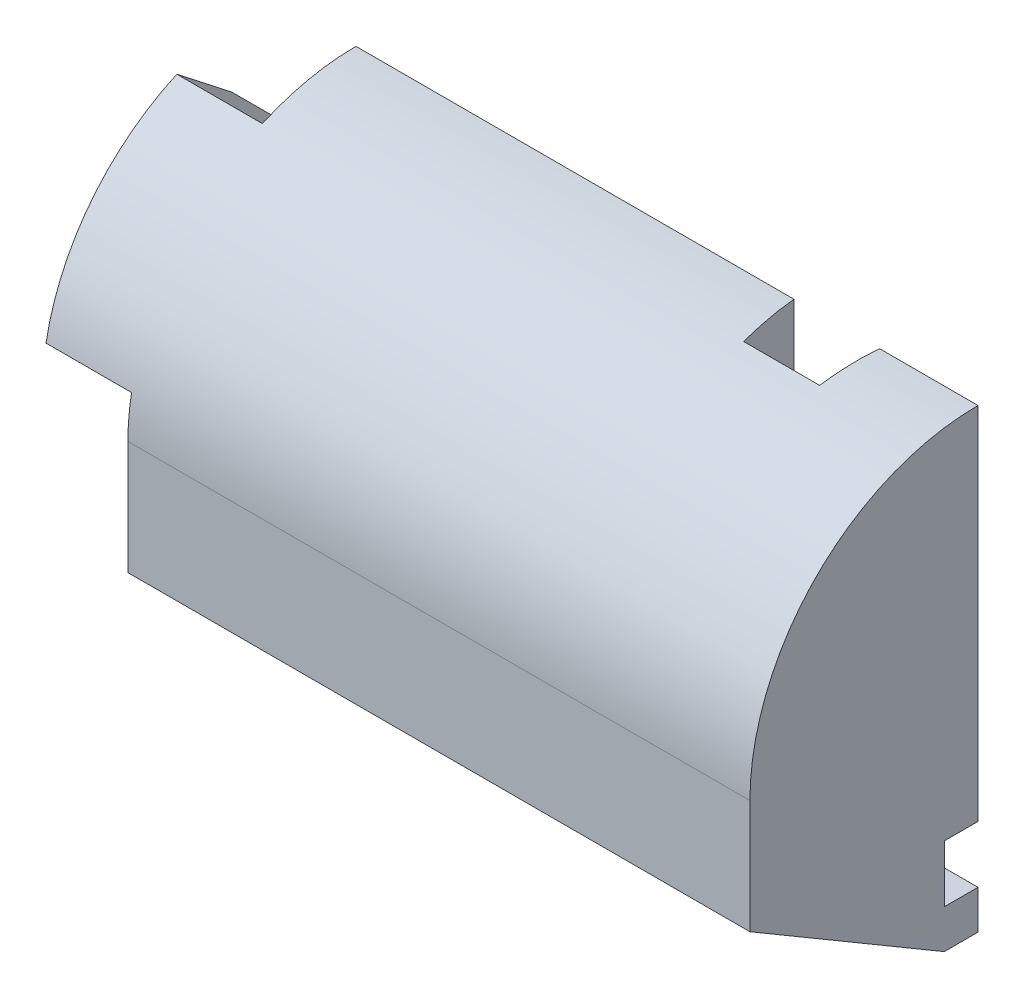
ISO-10303-21;
HEADER;
FILE_DESCRIPTION(('STEP AP214'),'2;1');
FILE_NAME('part.step','',(''),(''),'','','');
FILE_SCHEMA(('AUTOMOTIVE_DESIGN { 1 0 10303 214 1 1 1 1 }'));
ENDSEC;
DATA;
#1=APPLICATION_CONTEXT('core data for automotive mechanical design processes');
#2=APPLICATION_PROTOCOL_DEFINITION('international standard','automotive_design',2000,#1);
#3=PRODUCT_CONTEXT('',#1,'mechanical');
#4=PRODUCT('Part','Part','',(#3));
#5=PRODUCT_RELATED_PRODUCT_CATEGORY('part','',(#4));
#6=PRODUCT_DEFINITION_FORMATION('','',#4);
#7=PRODUCT_DEFINITION_CONTEXT('part definition',#1,'design');
#8=PRODUCT_DEFINITION('design','',#6,#7);
#9=PRODUCT_DEFINITION_SHAPE('','',#8);
#10=(LENGTH_UNIT() NAMED_UNIT(*) SI_UNIT(.MILLI.,.METRE.));
#11=(NAMED_UNIT(*) PLANE_ANGLE_UNIT() SI_UNIT($,.RADIAN.));
#12=(NAMED_UNIT(*) SI_UNIT($,.STERADIAN.) SOLID_ANGLE_UNIT());
#13=UNCERTAINTY_MEASURE_WITH_UNIT(LENGTH_MEASURE(1.E-05),#10,'distance_accuracy_value','');
#14=(GEOMETRIC_REPRESENTATION_CONTEXT(3) GLOBAL_UNCERTAINTY_ASSIGNED_CONTEXT((#13)) GLOBAL_UNIT_ASSIGNED_CONTEXT((#10,
#11,#12)) REPRESENTATION_CONTEXT('',''));
#15=CARTESIAN_POINT('',(0.,0.,0.));
#16=DIRECTION('',(0.,0.,1.));
#17=DIRECTION('',(1.,0.,0.));
#18=AXIS2_PLACEMENT_3D('',#15,#16,#17);
#19=CARTESIAN_POINT('',(240.,-88.,0.));
#20=DIRECTION('',(0.,0.,1.));
#21=DIRECTION('',(1.,0.,0.));
#22=AXIS2_PLACEMENT_3D('',#19,#20,#21);
#23=PLANE('',#22);
#24=DIRECTION('',(0.,-1.,0.));
#25=VECTOR('',#24,1.);
#26=CARTESIAN_POINT('',(169.,100.,0.));
#27=LINE('',#26,#25);
#28=CARTESIAN_POINT('',(169.,88.,0.));
#29=VERTEX_POINT('',#28);
#30=CARTESIAN_POINT('',(169.,28.575,0.));
#31=VERTEX_POINT('',#30);
#32=EDGE_CURVE('E191',#29,#31,#27,.T.);
#33=ORIENTED_EDGE('',*,*,#32,.T.);
#34=DIRECTION('',(-1.,0.,0.));
#35=VECTOR('',#34,1.);
#36=CARTESIAN_POINT('',(235.,28.575,0.));
#37=LINE('',#36,#35);
#38=CARTESIAN_POINT('',(78.0000000000001,28.575,0.));
#39=VERTEX_POINT('',#38);
#40=EDGE_CURVE('E242',#39,#31,#37,.F.);
#41=ORIENTED_EDGE('',*,*,#40,.F.);
#42=DIRECTION('',(0.,1.,0.));
#43=VECTOR('',#42,1.);
#44=CARTESIAN_POINT('',(78.,-88.,0.));
#45=LINE('',#44,#43);
#46=CARTESIAN_POINT('',(78.,44.45,0.));
#47=VERTEX_POINT('',#46);
#48=EDGE_CURVE('E348',#39,#47,#45,.T.);
#49=ORIENTED_EDGE('',*,*,#48,.T.);
#50=DIRECTION('',(-1.,0.,0.));
#51=VECTOR('',#50,1.);
#52=CARTESIAN_POINT('',(78.,44.45,0.));
#53=LINE('',#52,#51);
#54=CARTESIAN_POINT('',(0.,44.45,0.));
#55=VERTEX_POINT('',#54);
#56=EDGE_CURVE('E354',#55,#47,#53,.F.);
#57=ORIENTED_EDGE('',*,*,#56,.F.);
#58=DIRECTION('',(0.,1.,0.));
#59=VECTOR('',#58,1.);
#60=CARTESIAN_POINT('',(0.,-88.,0.));
#61=LINE('',#60,#59);
#62=CARTESIAN_POINT('',(0.,88.,0.));
#63=VERTEX_POINT('',#62);
#64=EDGE_CURVE('E275',#55,#63,#61,.T.);
#65=ORIENTED_EDGE('',*,*,#64,.T.);
#66=DIRECTION('',(-1.,0.,0.));
#67=VECTOR('',#66,1.);
#68=CARTESIAN_POINT('',(240.,88.,0.));
#69=LINE('',#68,#67);
#70=EDGE_CURVE('E208',#29,#63,#69,.T.);
#71=ORIENTED_EDGE('',*,*,#70,.F.);
#72=EDGE_LOOP('',(#33,#41,#49,#57,#65,#71));
#73=FACE_BOUND('',#72,.T.);
#74=ADVANCED_FACE('F39',(#73),#23,.F.);
#75=CARTESIAN_POINT('',(240.,0.,0.));
#76=DIRECTION('',(-1.,0.,0.));
#77=DIRECTION('',(0.,0.,1.));
#78=AXIS2_PLACEMENT_3D('',#75,#76,#77);
#79=CYLINDRICAL_SURFACE('',#78,88.);
#80=CARTESIAN_POINT('',(169.,0.,0.));
#81=DIRECTION('',(0.996194698091746,0.,-0.0871557427476516));
#82=DIRECTION('',(-0.0871557427476516,0.,-0.996194698091746));
#83=AXIS2_PLACEMENT_3D('',#80,#81,#82);
#84=ELLIPSE('',#83,88.3361457038145,88.);
#85=CARTESIAN_POINT('',(170.85743895347,85.400588921409,21.2306243873445));
#86=VERTEX_POINT('',#85);
#87=EDGE_CURVE('E236',#29,#86,#84,.T.);
#88=ORIENTED_EDGE('',*,*,#87,.F.);
#89=ORIENTED_EDGE('',*,*,#70,.T.);
#90=CARTESIAN_POINT('',(0.,0.,0.));
#91=DIRECTION('',(1.,0.,0.));
#92=DIRECTION('',(0.,0.,-1.));
#93=AXIS2_PLACEMENT_3D('',#90,#91,#92);
#94=CIRCLE('',#93,88.);
#95=CARTESIAN_POINT('',(0.,80.2470868267044,36.1165482269191));
#96=VERTEX_POINT('',#95);
#97=EDGE_CURVE('E272',#63,#96,#94,.T.);
#98=ORIENTED_EDGE('',*,*,#97,.T.);
#99=DIRECTION('',(1.,0.,0.));
#100=VECTOR('',#99,1.);
#101=CARTESIAN_POINT('',(-33.,80.2470868267044,36.1165482269191));
#102=LINE('',#101,#100);
#103=CARTESIAN_POINT('',(-33.,80.2470868267044,36.1165482269191));
#104=VERTEX_POINT('',#103);
#105=EDGE_CURVE('E62',#104,#96,#102,.T.);
#106=ORIENTED_EDGE('',*,*,#105,.F.);
#107=CARTESIAN_POINT('',(-33.,0.,0.));
#108=DIRECTION('',(1.,0.,0.));
#109=DIRECTION('',(0.,0.,-1.));
#110=AXIS2_PLACEMENT_3D('',#107,#108,#109);
#111=CIRCLE('',#110,88.);
#112=CARTESIAN_POINT('',(-33.,15.6302050309532,86.6007892036231));
#113=VERTEX_POINT('',#112);
#114=EDGE_CURVE('E303',#113,#104,#111,.F.);
#115=ORIENTED_EDGE('',*,*,#114,.F.);
#116=DIRECTION('',(1.,0.,0.));
#117=VECTOR('',#116,1.);
#118=CARTESIAN_POINT('',(-33.,15.6302050309532,86.6007892036231));
#119=LINE('',#118,#117);
#120=CARTESIAN_POINT('',(0.,15.6302050309532,86.6007892036231));
#121=VERTEX_POINT('',#120);
#122=EDGE_CURVE('E302',#113,#121,#119,.T.);
#123=ORIENTED_EDGE('',*,*,#122,.T.);
#124=CARTESIAN_POINT('',(0.,0.,88.));
#125=VERTEX_POINT('',#124);
#126=EDGE_CURVE('E271',#121,#125,#94,.T.);
#127=ORIENTED_EDGE('',*,*,#126,.T.);
#128=DIRECTION('',(-1.,0.,0.));
#129=VECTOR('',#128,1.);
#130=CARTESIAN_POINT('',(240.,0.,88.));
#131=LINE('',#130,#129);
#132=CARTESIAN_POINT('',(240.,0.,88.));
#133=VERTEX_POINT('',#132);
#134=EDGE_CURVE('E213',#133,#125,#131,.T.);
#135=ORIENTED_EDGE('',*,*,#134,.F.);
#136=CARTESIAN_POINT('',(240.,0.,0.));
#137=DIRECTION('',(1.,0.,0.));
#138=DIRECTION('',(0.,0.,-1.));
#139=AXIS2_PLACEMENT_3D('',#136,#137,#138);
#140=CIRCLE('',#139,88.);
#141=CARTESIAN_POINT('',(240.,88.,0.));
#142=VERTEX_POINT('',#141);
#143=EDGE_CURVE('E206',#142,#133,#140,.T.);
#144=ORIENTED_EDGE('',*,*,#143,.F.);
#145=CARTESIAN_POINT('',(202.,88.,0.));
#146=VERTEX_POINT('',#145);
#147=EDGE_CURVE('E198',#142,#146,#69,.T.);
#148=ORIENTED_EDGE('',*,*,#147,.T.);
#149=CARTESIAN_POINT('',(202.,0.,0.));
#150=DIRECTION('',(0.996194698091746,0.,0.0871557427476593));
#151=DIRECTION('',(-0.0871557427476593,0.,0.996194698091746));
#152=AXIS2_PLACEMENT_3D('',#149,#150,#151);
#153=ELLIPSE('',#152,88.3361457038146,88.);
#154=CARTESIAN_POINT('',(200.14256104653,85.4005889214091,21.2306243873445));
#155=VERTEX_POINT('',#154);
#156=EDGE_CURVE('E183',#146,#155,#153,.T.);
#157=ORIENTED_EDGE('',*,*,#156,.T.);
#158=DIRECTION('',(-1.,0.,0.));
#159=VECTOR('',#158,1.);
#160=CARTESIAN_POINT('',(240.,85.400588921409,21.2306243873445));
#161=LINE('',#160,#159);
#162=EDGE_CURVE('E190',#155,#86,#161,.T.);
#163=ORIENTED_EDGE('',*,*,#162,.T.);
#164=EDGE_LOOP('',(#88,#89,#98,#106,#115,#123,#127,#135,#144,#148,#157,#163));
#165=FACE_BOUND('',#164,.T.);
#166=ADVANCED_FACE('F204',(#165),#79,.T.);
#167=CARTESIAN_POINT('',(235.,0.,0.));
#168=DIRECTION('',(-1.,0.,0.));
#169=DIRECTION('',(0.,0.,1.));
#170=AXIS2_PLACEMENT_3D('',#167,#168,#169);
#171=CYLINDRICAL_SURFACE('',#170,28.575);
#172=ORIENTED_EDGE('',*,*,#40,.T.);
#173=CARTESIAN_POINT('',(169.,0.,0.));
#174=DIRECTION('',(0.996194698091746,0.,-0.0871557427476516));
#175=DIRECTION('',(-0.0871557427476516,0.,-0.996194698091746));
#176=AXIS2_PLACEMENT_3D('',#173,#174,#175);
#177=ELLIPSE('',#176,28.6841518578011,28.575);
#178=CARTESIAN_POINT('',(170.85743895347,19.1256689588494,21.2306243873445));
#179=VERTEX_POINT('',#178);
#180=EDGE_CURVE('E11',#31,#179,#177,.T.);
#181=ORIENTED_EDGE('',*,*,#180,.T.);
#182=DIRECTION('',(-1.,0.,0.));
#183=VECTOR('',#182,1.);
#184=CARTESIAN_POINT('',(235.,19.1256689588494,21.2306243873445));
#185=LINE('',#184,#183);
#186=CARTESIAN_POINT('',(200.14256104653,19.1256689588494,21.2306243873445));
#187=VERTEX_POINT('',#186);
#188=EDGE_CURVE('E47',#187,#179,#185,.T.);
#189=ORIENTED_EDGE('',*,*,#188,.F.);
#190=CARTESIAN_POINT('',(202.,0.,0.));
#191=DIRECTION('',(0.996194698091746,0.,0.0871557427476593));
#192=DIRECTION('',(-0.0871557427476593,0.,0.996194698091746));
#193=AXIS2_PLACEMENT_3D('',#190,#191,#192);
#194=ELLIPSE('',#193,28.6841518578012,28.575);
#195=CARTESIAN_POINT('',(202.,28.575,0.));
#196=VERTEX_POINT('',#195);
#197=EDGE_CURVE('E225',#196,#187,#194,.T.);
#198=ORIENTED_EDGE('',*,*,#197,.F.);
#199=CARTESIAN_POINT('',(235.,28.575,0.));
#200=VERTEX_POINT('',#199);
#201=EDGE_CURVE('E201',#196,#200,#37,.F.);
#202=ORIENTED_EDGE('',*,*,#201,.T.);
#203=CARTESIAN_POINT('',(235.,0.,0.));
#204=DIRECTION('',(1.,0.,0.));
#205=DIRECTION('',(0.,0.,-1.));
#206=AXIS2_PLACEMENT_3D('',#203,#204,#205);
#207=CIRCLE('',#206,28.575);
#208=CARTESIAN_POINT('',(235.,-28.575,0.));
#209=VERTEX_POINT('',#208);
#210=EDGE_CURVE('E355',#200,#209,#207,.T.);
#211=ORIENTED_EDGE('',*,*,#210,.T.);
#212=DIRECTION('',(-1.,0.,0.));
#213=VECTOR('',#212,1.);
#214=CARTESIAN_POINT('',(235.,-28.575,0.));
#215=LINE('',#214,#213);
#216=CARTESIAN_POINT('',(78.,-28.575,0.));
#217=VERTEX_POINT('',#216);
#218=EDGE_CURVE('E251',#209,#217,#215,.T.);
#219=ORIENTED_EDGE('',*,*,#218,.T.);
#220=CARTESIAN_POINT('',(78.,0.,0.));
#221=DIRECTION('',(1.,0.,0.));
#222=DIRECTION('',(0.,0.,-1.));
#223=AXIS2_PLACEMENT_3D('',#220,#221,#222);
#224=CIRCLE('',#223,28.575);
#225=EDGE_CURVE('E223',#39,#217,#224,.T.);
#226=ORIENTED_EDGE('',*,*,#225,.F.);
#227=EDGE_LOOP('',(#172,#181,#189,#198,#202,#211,#219,#226));
#228=FACE_BOUND('',#227,.T.);
#229=ADVANCED_FACE('F239',(#228),#171,.F.);
#230=CARTESIAN_POINT('',(0.,0.,0.));
#231=DIRECTION('',(1.,0.,0.));
#232=DIRECTION('',(0.,0.,-1.));
#233=AXIS2_PLACEMENT_3D('',#230,#231,#232);
#234=PLANE('',#233);
#235=DIRECTION('',(0.,0.615661475325659,0.788010753606721));
#236=VECTOR('',#235,1.);
#237=CARTESIAN_POINT('',(0.,-32.3084408978756,25.242120488352));
#238=LINE('',#237,#236);
#239=CARTESIAN_POINT('',(0.,-0.90970565626694,65.4306689222948));
#240=VERTEX_POINT('',#239);
#241=EDGE_CURVE('E298',#240,#121,#238,.T.);
#242=ORIENTED_EDGE('',*,*,#241,.F.);
#243=DIRECTION('',(0.,-0.788010753606721,0.615661475325659));
#244=VECTOR('',#243,1.);
#245=CARTESIAN_POINT('',(0.,31.3987352416086,40.1885484339428));
#246=LINE('',#245,#244);
#247=CARTESIAN_POINT('',(0.,63.7071761394842,14.9464279455908));
#248=VERTEX_POINT('',#247);
#249=EDGE_CURVE('E382',#248,#240,#246,.T.);
#250=ORIENTED_EDGE('',*,*,#249,.F.);
#251=DIRECTION('',(0.,0.615661475325659,0.788010753606722));
#252=VECTOR('',#251,1.);
#253=CARTESIAN_POINT('',(0.,32.3084408978756,-25.242120488352));
#254=LINE('',#253,#252);
#255=EDGE_CURVE('E371',#248,#96,#254,.T.);
#256=ORIENTED_EDGE('',*,*,#255,.T.);
#257=ORIENTED_EDGE('',*,*,#97,.F.);
#258=ORIENTED_EDGE('',*,*,#64,.F.);
#259=CARTESIAN_POINT('',(0.,0.,0.));
#260=DIRECTION('',(1.,0.,0.));
#261=DIRECTION('',(0.,0.,-1.));
#262=AXIS2_PLACEMENT_3D('',#259,#260,#261);
#263=CIRCLE('',#262,44.45);
#264=CARTESIAN_POINT('',(0.,-44.45,0.));
#265=VERTEX_POINT('',#264);
#266=EDGE_CURVE('E344',#55,#265,#263,.T.);
#267=ORIENTED_EDGE('',*,*,#266,.T.);
#268=CARTESIAN_POINT('',(0.,-88.,0.));
#269=VERTEX_POINT('',#268);
#270=EDGE_CURVE('E276',#269,#265,#61,.T.);
#271=ORIENTED_EDGE('',*,*,#270,.F.);
#272=DIRECTION('',(0.,0.,-1.));
#273=VECTOR('',#272,1.);
#274=CARTESIAN_POINT('',(0.,-88.,13.));
#275=LINE('',#274,#273);
#276=CARTESIAN_POINT('',(0.,-88.,13.));
#277=VERTEX_POINT('',#276);
#278=EDGE_CURVE('E259',#277,#269,#275,.T.);
#279=ORIENTED_EDGE('',*,*,#278,.F.);
#280=DIRECTION('',(0.,0.507267008045666,0.861788943157428));
#281=VECTOR('',#280,1.);
#282=CARTESIAN_POINT('',(0.,-88.,13.));
#283=LINE('',#282,#281);
#284=CARTESIAN_POINT('',(0.,-43.8534303491579,88.));
#285=VERTEX_POINT('',#284);
#286=EDGE_CURVE('E246',#277,#285,#283,.T.);
#287=ORIENTED_EDGE('',*,*,#286,.T.);
#288=DIRECTION('',(0.,1.,0.));
#289=VECTOR('',#288,1.);
#290=CARTESIAN_POINT('',(0.,-43.8534303491579,88.));
#291=LINE('',#290,#289);
#292=EDGE_CURVE('E249',#285,#125,#291,.T.);
#293=ORIENTED_EDGE('',*,*,#292,.T.);
#294=ORIENTED_EDGE('',*,*,#126,.F.);
#295=EDGE_LOOP('',(#242,#250,#256,#257,#258,#267,#271,#279,#287,#293,#294));
#296=FACE_BOUND('',#295,.T.);
#297=ADVANCED_FACE('F290',(#296),#234,.F.);
#298=ORIENTED_EDGE('',*,*,#201,.F.);
#299=DIRECTION('',(0.,-1.,0.));
#300=VECTOR('',#299,1.);
#301=CARTESIAN_POINT('',(202.,100.,0.));
#302=LINE('',#301,#300);
#303=EDGE_CURVE('E54',#146,#196,#302,.T.);
#304=ORIENTED_EDGE('',*,*,#303,.F.);
#305=ORIENTED_EDGE('',*,*,#147,.F.);
#306=DIRECTION('',(0.,1.,0.));
#307=VECTOR('',#306,1.);
#308=CARTESIAN_POINT('',(240.,0.,0.));
#309=LINE('',#308,#307);
#310=CARTESIAN_POINT('',(240.,-51.,0.));
#311=VERTEX_POINT('',#310);
#312=EDGE_CURVE('E263',#311,#142,#309,.T.);
#313=ORIENTED_EDGE('',*,*,#312,.F.);
#314=DIRECTION('',(1.,0.,0.));
#315=VECTOR('',#314,1.);
#316=CARTESIAN_POINT('',(0.,-51.,0.));
#317=LINE('',#316,#315);
#318=CARTESIAN_POINT('',(127.,-51.,0.));
#319=VERTEX_POINT('',#318);
#320=EDGE_CURVE('E320',#319,#311,#317,.T.);
#321=ORIENTED_EDGE('',*,*,#320,.F.);
#322=CARTESIAN_POINT('',(127.,-62.,0.));
#323=DIRECTION('',(0.,0.,1.));
#324=DIRECTION('',(1.,0.,0.));
#325=AXIS2_PLACEMENT_3D('',#322,#323,#324);
#326=CIRCLE('',#325,11.);
#327=CARTESIAN_POINT('',(127.,-73.,0.));
#328=VERTEX_POINT('',#327);
#329=EDGE_CURVE('E329',#328,#319,#326,.F.);
#330=ORIENTED_EDGE('',*,*,#329,.F.);
#331=DIRECTION('',(-1.,0.,0.));
#332=VECTOR('',#331,1.);
#333=CARTESIAN_POINT('',(0.,-73.0000000000001,0.));
#334=LINE('',#333,#332);
#335=CARTESIAN_POINT('',(240.,-73.,0.));
#336=VERTEX_POINT('',#335);
#337=EDGE_CURVE('E332',#336,#328,#334,.T.);
#338=ORIENTED_EDGE('',*,*,#337,.F.);
#339=CARTESIAN_POINT('',(240.,-88.,0.));
#340=VERTEX_POINT('',#339);
#341=EDGE_CURVE('E264',#340,#336,#309,.T.);
#342=ORIENTED_EDGE('',*,*,#341,.F.);
#343=DIRECTION('',(-1.,0.,0.));
#344=VECTOR('',#343,1.);
#345=CARTESIAN_POINT('',(240.,-88.,0.));
#346=LINE('',#345,#344);
#347=EDGE_CURVE('E207',#340,#269,#346,.T.);
#348=ORIENTED_EDGE('',*,*,#347,.T.);
#349=ORIENTED_EDGE('',*,*,#270,.T.);
#350=DIRECTION('',(-1.,0.,0.));
#351=VECTOR('',#350,1.);
#352=CARTESIAN_POINT('',(78.,-44.45,0.));
#353=LINE('',#352,#351);
#354=CARTESIAN_POINT('',(78.,-44.45,0.));
#355=VERTEX_POINT('',#354);
#356=EDGE_CURVE('E352',#355,#265,#353,.T.);
#357=ORIENTED_EDGE('',*,*,#356,.F.);
#358=EDGE_CURVE('E351',#355,#217,#45,.T.);
#359=ORIENTED_EDGE('',*,*,#358,.T.);
#360=ORIENTED_EDGE('',*,*,#218,.F.);
#361=DIRECTION('',(0.,1.,0.));
#362=VECTOR('',#361,1.);
#363=CARTESIAN_POINT('',(235.,-88.,0.));
#364=LINE('',#363,#362);
#365=EDGE_CURVE('E221',#209,#200,#364,.T.);
#366=ORIENTED_EDGE('',*,*,#365,.T.);
#367=EDGE_LOOP('',(#298,#304,#305,#313,#321,#330,#338,#342,#348,#349,#357,#359,#360,#366));
#368=FACE_BOUND('',#367,.T.);
#369=ADVANCED_FACE('F196',(#368),#23,.F.);
#370=CARTESIAN_POINT('',(240.,-88.,13.));
#371=DIRECTION('',(0.,-0.861788943157428,0.507267008045666));
#372=DIRECTION('',(0.,-0.507267008045667,-0.861788943157429));
#373=AXIS2_PLACEMENT_3D('',#370,#371,#372);
#374=PLANE('',#373);
#375=ORIENTED_EDGE('',*,*,#286,.F.);
#376=DIRECTION('',(-1.,0.,0.));
#377=VECTOR('',#376,1.);
#378=CARTESIAN_POINT('',(240.,-88.,13.));
#379=LINE('',#378,#377);
#380=CARTESIAN_POINT('',(240.,-88.,13.));
#381=VERTEX_POINT('',#380);
#382=EDGE_CURVE('E211',#381,#277,#379,.T.);
#383=ORIENTED_EDGE('',*,*,#382,.F.);
#384=DIRECTION('',(0.,0.507267008045666,0.861788943157428));
#385=VECTOR('',#384,1.);
#386=CARTESIAN_POINT('',(240.,-88.,13.));
#387=LINE('',#386,#385);
#388=CARTESIAN_POINT('',(240.,-43.8534303491579,88.));
#389=VERTEX_POINT('',#388);
#390=EDGE_CURVE('E255',#381,#389,#387,.T.);
#391=ORIENTED_EDGE('',*,*,#390,.T.);
#392=DIRECTION('',(-1.,0.,0.));
#393=VECTOR('',#392,1.);
#394=CARTESIAN_POINT('',(240.,-43.8534303491579,88.));
#395=LINE('',#394,#393);
#396=EDGE_CURVE('E218',#389,#285,#395,.T.);
#397=ORIENTED_EDGE('',*,*,#396,.T.);
#398=EDGE_LOOP('',(#375,#383,#391,#397));
#399=FACE_BOUND('',#398,.T.);
#400=ADVANCED_FACE('F41',(#399),#374,.T.);
#401=CARTESIAN_POINT('',(240.,-88.,13.));
#402=DIRECTION('',(0.,1.,0.));
#403=DIRECTION('',(0.,0.,1.));
#404=AXIS2_PLACEMENT_3D('',#401,#402,#403);
#405=PLANE('',#404);
#406=ORIENTED_EDGE('',*,*,#278,.T.);
#407=ORIENTED_EDGE('',*,*,#347,.F.);
#408=DIRECTION('',(0.,0.,-1.));
#409=VECTOR('',#408,1.);
#410=CARTESIAN_POINT('',(240.,-88.,13.));
#411=LINE('',#410,#409);
#412=EDGE_CURVE('E220',#381,#340,#411,.T.);
#413=ORIENTED_EDGE('',*,*,#412,.F.);
#414=ORIENTED_EDGE('',*,*,#382,.T.);
#415=EDGE_LOOP('',(#406,#407,#413,#414));
#416=FACE_BOUND('',#415,.T.);
#417=ADVANCED_FACE('F282',(#416),#405,.F.);
#418=CARTESIAN_POINT('',(240.,-43.8534303491579,88.));
#419=DIRECTION('',(0.,0.,1.));
#420=DIRECTION('',(1.,0.,0.));
#421=AXIS2_PLACEMENT_3D('',#418,#419,#420);
#422=PLANE('',#421);
#423=ORIENTED_EDGE('',*,*,#292,.F.);
#424=ORIENTED_EDGE('',*,*,#396,.F.);
#425=DIRECTION('',(0.,1.,0.));
#426=VECTOR('',#425,1.);
#427=CARTESIAN_POINT('',(240.,-43.8534303491579,88.));
#428=LINE('',#427,#426);
#429=EDGE_CURVE('E258',#389,#133,#428,.T.);
#430=ORIENTED_EDGE('',*,*,#429,.T.);
#431=ORIENTED_EDGE('',*,*,#134,.T.);
#432=EDGE_LOOP('',(#423,#424,#430,#431));
#433=FACE_BOUND('',#432,.T.);
#434=ADVANCED_FACE('F295',(#433),#422,.T.);
#435=CARTESIAN_POINT('',(240.,0.,0.));
#436=DIRECTION('',(1.,0.,0.));
#437=DIRECTION('',(0.,0.,-1.));
#438=AXIS2_PLACEMENT_3D('',#435,#436,#437);
#439=PLANE('',#438);
#440=DIRECTION('',(0.,0.,-1.));
#441=VECTOR('',#440,1.);
#442=CARTESIAN_POINT('',(240.,-73.,13.));
#443=LINE('',#442,#441);
#444=CARTESIAN_POINT('',(240.,-73.,13.));
#445=VERTEX_POINT('',#444);
#446=EDGE_CURVE('E340',#445,#336,#443,.T.);
#447=ORIENTED_EDGE('',*,*,#446,.F.);
#448=DIRECTION('',(0.,-1.,0.));
#449=VECTOR('',#448,1.);
#450=CARTESIAN_POINT('',(240.,0.,13.));
#451=LINE('',#450,#449);
#452=CARTESIAN_POINT('',(240.,-51.,13.));
#453=VERTEX_POINT('',#452);
#454=EDGE_CURVE('E323',#453,#445,#451,.T.);
#455=ORIENTED_EDGE('',*,*,#454,.F.);
#456=DIRECTION('',(0.,0.,-1.));
#457=VECTOR('',#456,1.);
#458=CARTESIAN_POINT('',(240.,-51.,13.));
#459=LINE('',#458,#457);
#460=EDGE_CURVE('E337',#453,#311,#459,.T.);
#461=ORIENTED_EDGE('',*,*,#460,.T.);
#462=ORIENTED_EDGE('',*,*,#312,.T.);
#463=ORIENTED_EDGE('',*,*,#143,.T.);
#464=ORIENTED_EDGE('',*,*,#429,.F.);
#465=ORIENTED_EDGE('',*,*,#390,.F.);
#466=ORIENTED_EDGE('',*,*,#412,.T.);
#467=ORIENTED_EDGE('',*,*,#341,.T.);
#468=EDGE_LOOP('',(#447,#455,#461,#462,#463,#464,#465,#466,#467));
#469=FACE_BOUND('',#468,.T.);
#470=ADVANCED_FACE('F422',(#469),#439,.T.);
#471=CARTESIAN_POINT('',(235.,0.,0.));
#472=DIRECTION('',(1.,0.,0.));
#473=DIRECTION('',(0.,0.,-1.));
#474=AXIS2_PLACEMENT_3D('',#471,#472,#473);
#475=PLANE('',#474);
#476=ORIENTED_EDGE('',*,*,#210,.F.);
#477=ORIENTED_EDGE('',*,*,#365,.F.);
#478=EDGE_LOOP('',(#476,#477));
#479=FACE_BOUND('',#478,.T.);
#480=ADVANCED_FACE('F430',(#479),#475,.F.);
#481=CARTESIAN_POINT('',(78.,0.,0.));
#482=DIRECTION('',(-1.,0.,0.));
#483=DIRECTION('',(0.,0.,1.));
#484=AXIS2_PLACEMENT_3D('',#481,#482,#483);
#485=CYLINDRICAL_SURFACE('',#484,44.45);
#486=ORIENTED_EDGE('',*,*,#56,.T.);
#487=CARTESIAN_POINT('',(78.,0.,0.));
#488=DIRECTION('',(1.,0.,0.));
#489=DIRECTION('',(0.,0.,-1.));
#490=AXIS2_PLACEMENT_3D('',#487,#488,#489);
#491=CIRCLE('',#490,44.45);
#492=EDGE_CURVE('E345',#47,#355,#491,.T.);
#493=ORIENTED_EDGE('',*,*,#492,.T.);
#494=ORIENTED_EDGE('',*,*,#356,.T.);
#495=ORIENTED_EDGE('',*,*,#266,.F.);
#496=EDGE_LOOP('',(#486,#493,#494,#495));
#497=FACE_BOUND('',#496,.T.);
#498=ADVANCED_FACE('F365',(#497),#485,.F.);
#499=CARTESIAN_POINT('',(78.,0.,0.));
#500=DIRECTION('',(1.,0.,0.));
#501=DIRECTION('',(0.,0.,-1.));
#502=AXIS2_PLACEMENT_3D('',#499,#500,#501);
#503=PLANE('',#502);
#504=ORIENTED_EDGE('',*,*,#492,.F.);
#505=ORIENTED_EDGE('',*,*,#48,.F.);
#506=ORIENTED_EDGE('',*,*,#225,.T.);
#507=ORIENTED_EDGE('',*,*,#358,.F.);
#508=EDGE_LOOP('',(#504,#505,#506,#507));
#509=FACE_BOUND('',#508,.T.);
#510=ADVANCED_FACE('F363',(#509),#503,.F.);
#511=CARTESIAN_POINT('',(127.,-62.,13.));
#512=DIRECTION('',(0.,0.,-1.));
#513=DIRECTION('',(-1.,0.,0.));
#514=AXIS2_PLACEMENT_3D('',#511,#512,#513);
#515=CYLINDRICAL_SURFACE('',#514,11.);
#516=ORIENTED_EDGE('',*,*,#329,.T.);
#517=DIRECTION('',(0.,0.,-1.));
#518=VECTOR('',#517,1.);
#519=CARTESIAN_POINT('',(127.,-51.,13.));
#520=LINE('',#519,#518);
#521=CARTESIAN_POINT('',(127.,-51.,13.));
#522=VERTEX_POINT('',#521);
#523=EDGE_CURVE('E328',#522,#319,#520,.T.);
#524=ORIENTED_EDGE('',*,*,#523,.F.);
#525=CARTESIAN_POINT('',(127.,-62.,13.));
#526=DIRECTION('',(0.,0.,1.));
#527=DIRECTION('',(1.,0.,0.));
#528=AXIS2_PLACEMENT_3D('',#525,#526,#527);
#529=CIRCLE('',#528,11.);
#530=CARTESIAN_POINT('',(127.,-73.,13.));
#531=VERTEX_POINT('',#530);
#532=EDGE_CURVE('E316',#531,#522,#529,.F.);
#533=ORIENTED_EDGE('',*,*,#532,.F.);
#534=DIRECTION('',(0.,0.,-1.));
#535=VECTOR('',#534,1.);
#536=CARTESIAN_POINT('',(127.,-73.,13.));
#537=LINE('',#536,#535);
#538=EDGE_CURVE('E342',#531,#328,#537,.T.);
#539=ORIENTED_EDGE('',*,*,#538,.T.);
#540=EDGE_LOOP('',(#516,#524,#533,#539));
#541=FACE_BOUND('',#540,.T.);
#542=ADVANCED_FACE('F445',(#541),#515,.F.);
#543=CARTESIAN_POINT('',(0.,-73.0000000000001,13.));
#544=DIRECTION('',(0.,-1.,0.));
#545=DIRECTION('',(1.,0.,0.));
#546=AXIS2_PLACEMENT_3D('',#543,#544,#545);
#547=PLANE('',#546);
#548=ORIENTED_EDGE('',*,*,#337,.T.);
#549=ORIENTED_EDGE('',*,*,#538,.F.);
#550=DIRECTION('',(-1.,0.,0.));
#551=VECTOR('',#550,1.);
#552=CARTESIAN_POINT('',(0.,-73.0000000000001,13.));
#553=LINE('',#552,#551);
#554=EDGE_CURVE('E319',#445,#531,#553,.T.);
#555=ORIENTED_EDGE('',*,*,#554,.F.);
#556=ORIENTED_EDGE('',*,*,#446,.T.);
#557=EDGE_LOOP('',(#548,#549,#555,#556));
#558=FACE_BOUND('',#557,.T.);
#559=ADVANCED_FACE('F441',(#558),#547,.F.);
#560=CARTESIAN_POINT('',(0.,-51.,13.));
#561=DIRECTION('',(0.,1.,0.));
#562=DIRECTION('',(0.,0.,1.));
#563=AXIS2_PLACEMENT_3D('',#560,#561,#562);
#564=PLANE('',#563);
#565=ORIENTED_EDGE('',*,*,#320,.T.);
#566=ORIENTED_EDGE('',*,*,#460,.F.);
#567=DIRECTION('',(1.,0.,0.));
#568=VECTOR('',#567,1.);
#569=CARTESIAN_POINT('',(0.,-51.,13.));
#570=LINE('',#569,#568);
#571=EDGE_CURVE('E326',#522,#453,#570,.T.);
#572=ORIENTED_EDGE('',*,*,#571,.F.);
#573=ORIENTED_EDGE('',*,*,#523,.T.);
#574=EDGE_LOOP('',(#565,#566,#572,#573));
#575=FACE_BOUND('',#574,.T.);
#576=ADVANCED_FACE('F400',(#575),#564,.F.);
#577=CARTESIAN_POINT('',(0.,0.,13.));
#578=DIRECTION('',(0.,0.,1.));
#579=DIRECTION('',(1.,0.,0.));
#580=AXIS2_PLACEMENT_3D('',#577,#578,#579);
#581=PLANE('',#580);
#582=ORIENTED_EDGE('',*,*,#532,.T.);
#583=ORIENTED_EDGE('',*,*,#571,.T.);
#584=ORIENTED_EDGE('',*,*,#454,.T.);
#585=ORIENTED_EDGE('',*,*,#554,.T.);
#586=EDGE_LOOP('',(#582,#583,#584,#585));
#587=FACE_BOUND('',#586,.T.);
#588=ADVANCED_FACE('F392',(#587),#581,.F.);
#589=CARTESIAN_POINT('',(-33.,32.3084408978756,-25.242120488352));
#590=DIRECTION('',(0.,0.788010753606722,-0.615661475325659));
#591=DIRECTION('',(0.,0.615661475325659,0.788010753606722));
#592=AXIS2_PLACEMENT_3D('',#589,#590,#591);
#593=PLANE('',#592);
#594=ORIENTED_EDGE('',*,*,#255,.F.);
#595=DIRECTION('',(1.,0.,0.));
#596=VECTOR('',#595,1.);
#597=CARTESIAN_POINT('',(-33.,63.7071761394842,14.9464279455908));
#598=LINE('',#597,#596);
#599=CARTESIAN_POINT('',(-33.,63.7071761394842,14.9464279455908));
#600=VERTEX_POINT('',#599);
#601=EDGE_CURVE('E310',#600,#248,#598,.T.);
#602=ORIENTED_EDGE('',*,*,#601,.F.);
#603=DIRECTION('',(0.,0.615661475325659,0.788010753606722));
#604=VECTOR('',#603,1.);
#605=CARTESIAN_POINT('',(-33.,32.3084408978756,-25.242120488352));
#606=LINE('',#605,#604);
#607=EDGE_CURVE('E307',#600,#104,#606,.T.);
#608=ORIENTED_EDGE('',*,*,#607,.T.);
#609=ORIENTED_EDGE('',*,*,#105,.T.);
#610=EDGE_LOOP('',(#594,#602,#608,#609));
#611=FACE_BOUND('',#610,.T.);
#612=ADVANCED_FACE('F390',(#611),#593,.T.);
#613=CARTESIAN_POINT('',(-33.,31.3987352416086,40.1885484339428));
#614=DIRECTION('',(0.,0.615661475325659,0.788010753606721));
#615=DIRECTION('',(0.,-0.788010753606721,0.615661475325659));
#616=AXIS2_PLACEMENT_3D('',#613,#614,#615);
#617=PLANE('',#616);
#618=ORIENTED_EDGE('',*,*,#249,.T.);
#619=DIRECTION('',(1.,0.,0.));
#620=VECTOR('',#619,1.);
#621=CARTESIAN_POINT('',(-33.,-0.90970565626694,65.4306689222948));
#622=LINE('',#621,#620);
#623=CARTESIAN_POINT('',(-33.,-0.90970565626694,65.4306689222948));
#624=VERTEX_POINT('',#623);
#625=EDGE_CURVE('E306',#624,#240,#622,.T.);
#626=ORIENTED_EDGE('',*,*,#625,.F.);
#627=DIRECTION('',(0.,-0.788010753606721,0.615661475325659));
#628=VECTOR('',#627,1.);
#629=CARTESIAN_POINT('',(-33.,31.3987352416086,40.1885484339428));
#630=LINE('',#629,#628);
#631=EDGE_CURVE('E312',#600,#624,#630,.T.);
#632=ORIENTED_EDGE('',*,*,#631,.F.);
#633=ORIENTED_EDGE('',*,*,#601,.T.);
#634=EDGE_LOOP('',(#618,#626,#632,#633));
#635=FACE_BOUND('',#634,.T.);
#636=ADVANCED_FACE('F387',(#635),#617,.F.);
#637=CARTESIAN_POINT('',(-33.,-32.3084408978756,25.242120488352));
#638=DIRECTION('',(0.,0.788010753606721,-0.615661475325659));
#639=DIRECTION('',(0.,0.615661475325659,0.788010753606721));
#640=AXIS2_PLACEMENT_3D('',#637,#638,#639);
#641=PLANE('',#640);
#642=ORIENTED_EDGE('',*,*,#241,.T.);
#643=ORIENTED_EDGE('',*,*,#122,.F.);
#644=DIRECTION('',(0.,0.615661475325659,0.788010753606721));
#645=VECTOR('',#644,1.);
#646=CARTESIAN_POINT('',(-33.,-32.3084408978756,25.242120488352));
#647=LINE('',#646,#645);
#648=EDGE_CURVE('E378',#624,#113,#647,.T.);
#649=ORIENTED_EDGE('',*,*,#648,.F.);
#650=ORIENTED_EDGE('',*,*,#625,.T.);
#651=EDGE_LOOP('',(#642,#643,#649,#650));
#652=FACE_BOUND('',#651,.T.);
#653=ADVANCED_FACE('F398',(#652),#641,.F.);
#654=CARTESIAN_POINT('',(-33.,0.,0.));
#655=DIRECTION('',(1.,0.,0.));
#656=DIRECTION('',(0.,0.,-1.));
#657=AXIS2_PLACEMENT_3D('',#654,#655,#656);
#658=PLANE('',#657);
#659=ORIENTED_EDGE('',*,*,#114,.T.);
#660=ORIENTED_EDGE('',*,*,#607,.F.);
#661=ORIENTED_EDGE('',*,*,#631,.T.);
#662=ORIENTED_EDGE('',*,*,#648,.T.);
#663=EDGE_LOOP('',(#659,#660,#661,#662));
#664=FACE_BOUND('',#663,.T.);
#665=ADVANCED_FACE('F515',(#664),#658,.F.);
#666=CARTESIAN_POINT('',(167.716255129532,100.,-14.6732710128545));
#667=DIRECTION('',(0.996194698091746,0.,-0.0871557427476516));
#668=DIRECTION('',(-0.0871557427476516,0.,-0.996194698091746));
#669=AXIS2_PLACEMENT_3D('',#666,#667,#668);
#670=PLANE('',#669);
#671=ORIENTED_EDGE('',*,*,#87,.T.);
#672=DIRECTION('',(0.,-1.,0.));
#673=VECTOR('',#672,1.);
#674=CARTESIAN_POINT('',(170.85743895347,100.,21.2306243873445));
#675=LINE('',#674,#673);
#676=EDGE_CURVE('E231',#86,#179,#675,.T.);
#677=ORIENTED_EDGE('',*,*,#676,.T.);
#678=ORIENTED_EDGE('',*,*,#180,.F.);
#679=ORIENTED_EDGE('',*,*,#32,.F.);
#680=EDGE_LOOP('',(#671,#677,#678,#679));
#681=FACE_BOUND('',#680,.T.);
#682=ADVANCED_FACE('F234',(#681),#670,.T.);
#683=CARTESIAN_POINT('',(0.,100.,21.2306243873445));
#684=DIRECTION('',(0.,0.,1.));
#685=DIRECTION('',(1.,0.,0.));
#686=AXIS2_PLACEMENT_3D('',#683,#684,#685);
#687=PLANE('',#686);
#688=DIRECTION('',(0.,-1.,0.));
#689=VECTOR('',#688,1.);
#690=CARTESIAN_POINT('',(200.14256104653,100.,21.2306243873445));
#691=LINE('',#690,#689);
#692=EDGE_CURVE('E186',#155,#187,#691,.T.);
#693=ORIENTED_EDGE('',*,*,#692,.T.);
#694=ORIENTED_EDGE('',*,*,#188,.T.);
#695=ORIENTED_EDGE('',*,*,#676,.F.);
#696=ORIENTED_EDGE('',*,*,#162,.F.);
#697=EDGE_LOOP('',(#693,#694,#695,#696));
#698=FACE_BOUND('',#697,.T.);
#699=ADVANCED_FACE('F230',(#698),#687,.F.);
#700=CARTESIAN_POINT('',(200.465583054233,100.,17.5384659443602));
#701=DIRECTION('',(0.996194698091746,0.,0.0871557427476593));
#702=DIRECTION('',(0.0871557427476593,0.,-0.996194698091746));
#703=AXIS2_PLACEMENT_3D('',#700,#701,#702);
#704=PLANE('',#703);
#705=ORIENTED_EDGE('',*,*,#303,.T.);
#706=ORIENTED_EDGE('',*,*,#197,.T.);
#707=ORIENTED_EDGE('',*,*,#692,.F.);
#708=ORIENTED_EDGE('',*,*,#156,.F.);
#709=EDGE_LOOP('',(#705,#706,#707,#708));
#710=FACE_BOUND('',#709,.T.);
#711=ADVANCED_FACE('F184',(#710),#704,.F.);
#712=CLOSED_SHELL('',(#74,#166,#229,#297,#369,#400,#417,#434,#470,#480,#498,#510,#542,#559,#576,
#588,#612,#636,#653,#665,#682,#699,#711));
#713=MANIFOLD_SOLID_BREP('B2',#712);
#714=ADVANCED_BREP_SHAPE_REPRESENTATION('',(#18,#713),#14);
#715=SHAPE_DEFINITION_REPRESENTATION(#9,#714);
ENDSEC;
END-ISO-10303-21;
